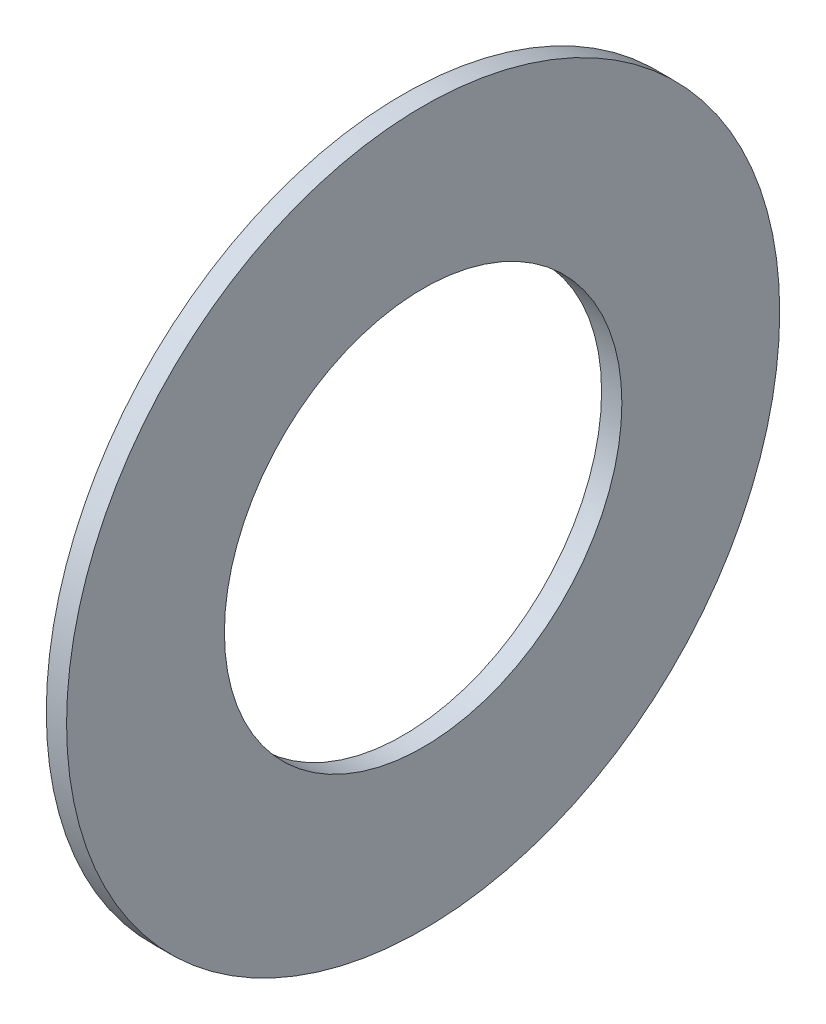
ISO-10303-21;
HEADER;
FILE_DESCRIPTION(('STEP AP214'),'2;1');
FILE_NAME('part.step','',(''),(''),'','','');
FILE_SCHEMA(('AUTOMOTIVE_DESIGN { 1 0 10303 214 1 1 1 1 }'));
ENDSEC;
DATA;
#1=APPLICATION_CONTEXT('core data for automotive mechanical design processes');
#2=APPLICATION_PROTOCOL_DEFINITION('international standard','automotive_design',2000,#1);
#3=PRODUCT_CONTEXT('',#1,'mechanical');
#4=PRODUCT('Part','Part','',(#3));
#5=PRODUCT_RELATED_PRODUCT_CATEGORY('part','',(#4));
#6=PRODUCT_DEFINITION_FORMATION('','',#4);
#7=PRODUCT_DEFINITION_CONTEXT('part definition',#1,'design');
#8=PRODUCT_DEFINITION('design','',#6,#7);
#9=PRODUCT_DEFINITION_SHAPE('','',#8);
#10=(LENGTH_UNIT() NAMED_UNIT(*) SI_UNIT(.MILLI.,.METRE.));
#11=(NAMED_UNIT(*) PLANE_ANGLE_UNIT() SI_UNIT($,.RADIAN.));
#12=(NAMED_UNIT(*) SI_UNIT($,.STERADIAN.) SOLID_ANGLE_UNIT());
#13=UNCERTAINTY_MEASURE_WITH_UNIT(LENGTH_MEASURE(1.E-05),#10,'distance_accuracy_value','');
#14=(GEOMETRIC_REPRESENTATION_CONTEXT(3) GLOBAL_UNCERTAINTY_ASSIGNED_CONTEXT((#13)) GLOBAL_UNIT_ASSIGNED_CONTEXT((#10,
#11,#12)) REPRESENTATION_CONTEXT('',''));
#15=CARTESIAN_POINT('',(0.,0.,0.));
#16=DIRECTION('',(0.,0.,1.));
#17=DIRECTION('',(1.,0.,0.));
#18=AXIS2_PLACEMENT_3D('',#15,#16,#17);
#19=CARTESIAN_POINT('',(0.4064,0.,0.));
#20=DIRECTION('',(1.,0.,0.));
#21=DIRECTION('',(0.,0.,-1.));
#22=AXIS2_PLACEMENT_3D('',#19,#20,#21);
#23=PLANE('',#22);
#24=CARTESIAN_POINT('',(0.4064,0.,0.));
#25=DIRECTION('',(1.,0.,0.));
#26=DIRECTION('',(0.,0.,-1.));
#27=AXIS2_PLACEMENT_3D('',#24,#25,#26);
#28=CIRCLE('',#27,14.2875);
#29=CARTESIAN_POINT('',(0.4064,0.,-14.2875));
#30=VERTEX_POINT('',#29);
#31=EDGE_CURVE('E10',#30,#30,#28,.T.);
#32=ORIENTED_EDGE('',*,*,#31,.T.);
#33=EDGE_LOOP('',(#32));
#34=FACE_BOUND('',#33,.T.);
#35=CARTESIAN_POINT('',(0.4064,0.,0.));
#36=DIRECTION('',(1.,0.,0.));
#37=DIRECTION('',(0.,0.,-1.));
#38=AXIS2_PLACEMENT_3D('',#35,#36,#37);
#39=CIRCLE('',#38,7.9629);
#40=CARTESIAN_POINT('',(0.4064,0.,-7.9629));
#41=VERTEX_POINT('',#40);
#42=EDGE_CURVE('E41',#41,#41,#39,.T.);
#43=ORIENTED_EDGE('',*,*,#42,.F.);
#44=EDGE_LOOP('',(#43));
#45=FACE_BOUND('',#44,.T.);
#46=ADVANCED_FACE('F30',(#34,#45),#23,.T.);
#47=CARTESIAN_POINT('',(-0.4064,0.,0.));
#48=DIRECTION('',(1.,0.,0.));
#49=DIRECTION('',(0.,0.,-1.));
#50=AXIS2_PLACEMENT_3D('',#47,#48,#49);
#51=PLANE('',#50);
#52=CARTESIAN_POINT('',(-0.4064,0.,0.));
#53=DIRECTION('',(1.,0.,0.));
#54=DIRECTION('',(0.,0.,-1.));
#55=AXIS2_PLACEMENT_3D('',#52,#53,#54);
#56=CIRCLE('',#55,14.2875);
#57=CARTESIAN_POINT('',(-0.4064,0.,-14.2875));
#58=VERTEX_POINT('',#57);
#59=EDGE_CURVE('E34',#58,#58,#56,.T.);
#60=ORIENTED_EDGE('',*,*,#59,.F.);
#61=EDGE_LOOP('',(#60));
#62=FACE_BOUND('',#61,.T.);
#63=CARTESIAN_POINT('',(-0.4064,0.,0.));
#64=DIRECTION('',(1.,0.,0.));
#65=DIRECTION('',(0.,0.,-1.));
#66=AXIS2_PLACEMENT_3D('',#63,#64,#65);
#67=CIRCLE('',#66,7.9629);
#68=CARTESIAN_POINT('',(-0.4064,0.,-7.9629));
#69=VERTEX_POINT('',#68);
#70=EDGE_CURVE('E43',#69,#69,#67,.T.);
#71=ORIENTED_EDGE('',*,*,#70,.T.);
#72=EDGE_LOOP('',(#71));
#73=FACE_BOUND('',#72,.T.);
#74=ADVANCED_FACE('F53',(#62,#73),#51,.F.);
#75=CARTESIAN_POINT('',(0.4064,0.,0.));
#76=DIRECTION('',(-1.,0.,0.));
#77=DIRECTION('',(0.,0.,1.));
#78=AXIS2_PLACEMENT_3D('',#75,#76,#77);
#79=CYLINDRICAL_SURFACE('',#78,14.2875);
#80=ORIENTED_EDGE('',*,*,#31,.F.);
#81=EDGE_LOOP('',(#80));
#82=FACE_BOUND('',#81,.T.);
#83=ORIENTED_EDGE('',*,*,#59,.T.);
#84=EDGE_LOOP('',(#83));
#85=FACE_BOUND('',#84,.T.);
#86=ADVANCED_FACE('F32',(#82,#85),#79,.T.);
#87=CARTESIAN_POINT('',(0.4064,0.,0.));
#88=DIRECTION('',(-1.,0.,0.));
#89=DIRECTION('',(0.,0.,1.));
#90=AXIS2_PLACEMENT_3D('',#87,#88,#89);
#91=CYLINDRICAL_SURFACE('',#90,7.9629);
#92=ORIENTED_EDGE('',*,*,#42,.T.);
#93=EDGE_LOOP('',(#92));
#94=FACE_BOUND('',#93,.T.);
#95=ORIENTED_EDGE('',*,*,#70,.F.);
#96=EDGE_LOOP('',(#95));
#97=FACE_BOUND('',#96,.T.);
#98=ADVANCED_FACE('F49',(#94,#97),#91,.F.);
#99=CLOSED_SHELL('',(#46,#74,#86,#98));
#100=MANIFOLD_SOLID_BREP('B2',#99);
#101=ADVANCED_BREP_SHAPE_REPRESENTATION('',(#18,#100),#14);
#102=SHAPE_DEFINITION_REPRESENTATION(#9,#101);
ENDSEC;
END-ISO-10303-21;
